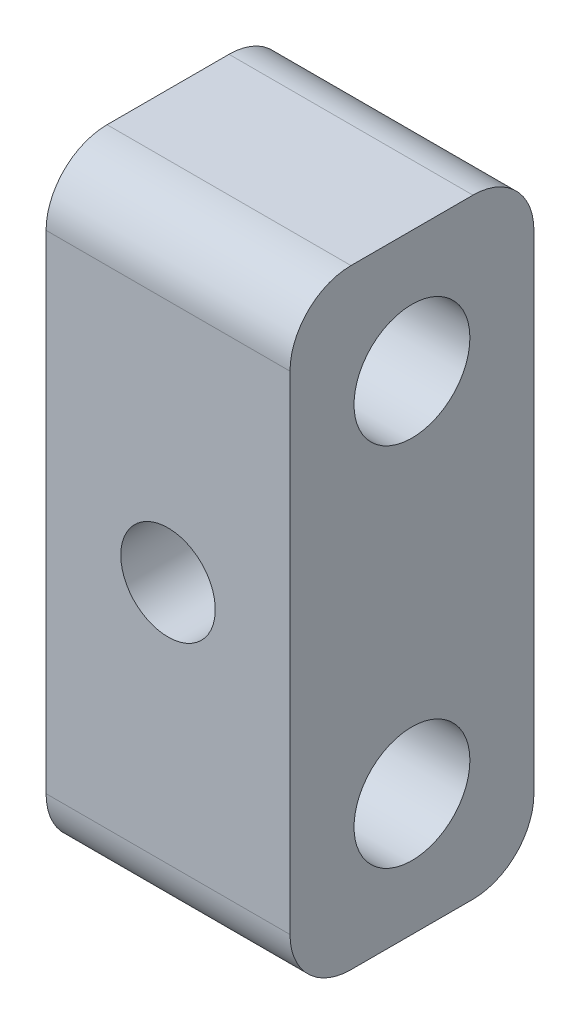
ISO-10303-21;
HEADER;
FILE_DESCRIPTION(('STEP AP214'),'2;1');
FILE_NAME('part.step','',(''),(''),'','','');
FILE_SCHEMA(('AUTOMOTIVE_DESIGN { 1 0 10303 214 1 1 1 1 }'));
ENDSEC;
DATA;
#1=APPLICATION_CONTEXT('core data for automotive mechanical design processes');
#2=APPLICATION_PROTOCOL_DEFINITION('international standard','automotive_design',2000,#1);
#3=PRODUCT_CONTEXT('',#1,'mechanical');
#4=PRODUCT('Part','Part','',(#3));
#5=PRODUCT_RELATED_PRODUCT_CATEGORY('part','',(#4));
#6=PRODUCT_DEFINITION_FORMATION('','',#4);
#7=PRODUCT_DEFINITION_CONTEXT('part definition',#1,'design');
#8=PRODUCT_DEFINITION('design','',#6,#7);
#9=PRODUCT_DEFINITION_SHAPE('','',#8);
#10=(LENGTH_UNIT() NAMED_UNIT(*) SI_UNIT(.MILLI.,.METRE.));
#11=(NAMED_UNIT(*) PLANE_ANGLE_UNIT() SI_UNIT($,.RADIAN.));
#12=(NAMED_UNIT(*) SI_UNIT($,.STERADIAN.) SOLID_ANGLE_UNIT());
#13=UNCERTAINTY_MEASURE_WITH_UNIT(LENGTH_MEASURE(1.E-05),#10,'distance_accuracy_value','');
#14=(GEOMETRIC_REPRESENTATION_CONTEXT(3) GLOBAL_UNCERTAINTY_ASSIGNED_CONTEXT((#13)) GLOBAL_UNIT_ASSIGNED_CONTEXT((#10,
#11,#12)) REPRESENTATION_CONTEXT('',''));
#15=CARTESIAN_POINT('',(0.,0.,0.));
#16=DIRECTION('',(0.,0.,1.));
#17=DIRECTION('',(1.,0.,0.));
#18=AXIS2_PLACEMENT_3D('',#15,#16,#17);
#19=CARTESIAN_POINT('',(4.,0.,4.));
#20=DIRECTION('',(0.,0.,-1.));
#21=DIRECTION('',(-1.,0.,0.));
#22=AXIS2_PLACEMENT_3D('',#19,#20,#21);
#23=CYLINDRICAL_SURFACE('',#22,1.55);
#24=CARTESIAN_POINT('',(4.,0.,4.));
#25=DIRECTION('',(0.,0.,-1.));
#26=DIRECTION('',(-1.,0.,0.));
#27=AXIS2_PLACEMENT_3D('',#24,#25,#26);
#28=CIRCLE('',#27,1.55);
#29=CARTESIAN_POINT('',(2.45,0.,4.));
#30=VERTEX_POINT('',#29);
#31=EDGE_CURVE('E208',#30,#30,#28,.T.);
#32=ORIENTED_EDGE('',*,*,#31,.F.);
#33=EDGE_LOOP('',(#32));
#34=FACE_BOUND('',#33,.T.);
#35=CARTESIAN_POINT('',(4.,0.,1.));
#36=DIRECTION('',(0.,0.,-1.));
#37=DIRECTION('',(-1.,0.,0.));
#38=AXIS2_PLACEMENT_3D('',#35,#36,#37);
#39=CIRCLE('',#38,1.55);
#40=CARTESIAN_POINT('',(2.45,0.,1.));
#41=VERTEX_POINT('',#40);
#42=EDGE_CURVE('E187',#41,#41,#39,.F.);
#43=ORIENTED_EDGE('',*,*,#42,.F.);
#44=EDGE_LOOP('',(#43));
#45=FACE_BOUND('',#44,.T.);
#46=ADVANCED_FACE('F33',(#34,#45),#23,.F.);
#47=CARTESIAN_POINT('',(8.,6.,0.));
#48=DIRECTION('',(-1.,0.,0.));
#49=DIRECTION('',(0.,0.,1.));
#50=AXIS2_PLACEMENT_3D('',#47,#48,#49);
#51=CYLINDRICAL_SURFACE('',#50,1.55);
#52=CARTESIAN_POINT('',(0.,6.,0.));
#53=DIRECTION('',(1.,0.,0.));
#54=DIRECTION('',(0.,0.,-1.));
#55=AXIS2_PLACEMENT_3D('',#52,#53,#54);
#56=CIRCLE('',#55,1.55);
#57=CARTESIAN_POINT('',(0.,6.,-1.55));
#58=VERTEX_POINT('',#57);
#59=EDGE_CURVE('E215',#58,#58,#56,.T.);
#60=ORIENTED_EDGE('',*,*,#59,.F.);
#61=EDGE_LOOP('',(#60));
#62=FACE_BOUND('',#61,.T.);
#63=CARTESIAN_POINT('',(5.,6.,0.));
#64=DIRECTION('',(1.,0.,0.));
#65=DIRECTION('',(0.,0.,-1.));
#66=AXIS2_PLACEMENT_3D('',#63,#64,#65);
#67=CIRCLE('',#66,1.55);
#68=CARTESIAN_POINT('',(5.,6.,-1.55));
#69=VERTEX_POINT('',#68);
#70=EDGE_CURVE('E212',#69,#69,#67,.T.);
#71=ORIENTED_EDGE('',*,*,#70,.T.);
#72=EDGE_LOOP('',(#71));
#73=FACE_BOUND('',#72,.T.);
#74=ADVANCED_FACE('F314',(#62,#73),#51,.F.);
#75=CARTESIAN_POINT('',(8.,-6.,0.));
#76=DIRECTION('',(-1.,0.,0.));
#77=DIRECTION('',(0.,0.,1.));
#78=AXIS2_PLACEMENT_3D('',#75,#76,#77);
#79=CYLINDRICAL_SURFACE('',#78,1.55);
#80=CARTESIAN_POINT('',(0.,-6.,0.));
#81=DIRECTION('',(1.,0.,0.));
#82=DIRECTION('',(0.,0.,1.));
#83=AXIS2_PLACEMENT_3D('',#80,#81,#82);
#84=CIRCLE('',#83,1.55);
#85=CARTESIAN_POINT('',(0.,-6.,1.55));
#86=VERTEX_POINT('',#85);
#87=EDGE_CURVE('E211',#86,#86,#84,.T.);
#88=ORIENTED_EDGE('',*,*,#87,.F.);
#89=EDGE_LOOP('',(#88));
#90=FACE_BOUND('',#89,.T.);
#91=CARTESIAN_POINT('',(5.,-6.,0.));
#92=DIRECTION('',(1.,0.,0.));
#93=DIRECTION('',(0.,0.,-1.));
#94=AXIS2_PLACEMENT_3D('',#91,#92,#93);
#95=CIRCLE('',#94,1.55);
#96=CARTESIAN_POINT('',(5.,-6.,-1.55));
#97=VERTEX_POINT('',#96);
#98=EDGE_CURVE('E198',#97,#97,#95,.T.);
#99=ORIENTED_EDGE('',*,*,#98,.T.);
#100=EDGE_LOOP('',(#99));
#101=FACE_BOUND('',#100,.T.);
#102=ADVANCED_FACE('F320',(#90,#101),#79,.F.);
#103=CARTESIAN_POINT('',(8.,0.,0.));
#104=DIRECTION('',(-1.,0.,0.));
#105=DIRECTION('',(0.,0.,1.));
#106=AXIS2_PLACEMENT_3D('',#103,#104,#105);
#107=PLANE('',#106);
#108=CARTESIAN_POINT('',(8.,6.,0.));
#109=DIRECTION('',(1.,0.,0.));
#110=DIRECTION('',(0.,0.,-1.));
#111=AXIS2_PLACEMENT_3D('',#108,#109,#110);
#112=CIRCLE('',#111,1.9);
#113=CARTESIAN_POINT('',(8.,6.,-1.9));
#114=VERTEX_POINT('',#113);
#115=EDGE_CURVE('E199',#114,#114,#112,.T.);
#116=ORIENTED_EDGE('',*,*,#115,.F.);
#117=EDGE_LOOP('',(#116));
#118=FACE_BOUND('',#117,.T.);
#119=CARTESIAN_POINT('',(8.,-6.,0.));
#120=DIRECTION('',(1.,0.,0.));
#121=DIRECTION('',(0.,0.,-1.));
#122=AXIS2_PLACEMENT_3D('',#119,#120,#121);
#123=CIRCLE('',#122,1.9);
#124=CARTESIAN_POINT('',(8.,-6.,-1.9));
#125=VERTEX_POINT('',#124);
#126=EDGE_CURVE('E205',#125,#125,#123,.T.);
#127=ORIENTED_EDGE('',*,*,#126,.F.);
#128=EDGE_LOOP('',(#127));
#129=FACE_BOUND('',#128,.T.);
#130=DIRECTION('',(0.,-1.,0.));
#131=VECTOR('',#130,1.);
#132=CARTESIAN_POINT('',(8.,-10.,4.));
#133=LINE('',#132,#131);
#134=CARTESIAN_POINT('',(8.,8.,4.));
#135=VERTEX_POINT('',#134);
#136=CARTESIAN_POINT('',(8.,-8.,4.));
#137=VERTEX_POINT('',#136);
#138=EDGE_CURVE('E224',#135,#137,#133,.T.);
#139=ORIENTED_EDGE('',*,*,#138,.T.);
#140=CARTESIAN_POINT('',(8.,-8.,2.));
#141=DIRECTION('',(-1.,0.,0.));
#142=DIRECTION('',(0.,0.,1.));
#143=AXIS2_PLACEMENT_3D('',#140,#141,#142);
#144=CIRCLE('',#143,2.);
#145=CARTESIAN_POINT('',(8.,-10.,2.));
#146=VERTEX_POINT('',#145);
#147=EDGE_CURVE('E268',#137,#146,#144,.F.);
#148=ORIENTED_EDGE('',*,*,#147,.T.);
#149=DIRECTION('',(0.,0.,-1.));
#150=VECTOR('',#149,1.);
#151=CARTESIAN_POINT('',(8.,-10.,4.));
#152=LINE('',#151,#150);
#153=CARTESIAN_POINT('',(8.,-10.,-2.));
#154=VERTEX_POINT('',#153);
#155=EDGE_CURVE('E227',#146,#154,#152,.T.);
#156=ORIENTED_EDGE('',*,*,#155,.T.);
#157=CARTESIAN_POINT('',(8.,-8.,-2.));
#158=DIRECTION('',(-1.,0.,0.));
#159=DIRECTION('',(0.,0.,1.));
#160=AXIS2_PLACEMENT_3D('',#157,#158,#159);
#161=CIRCLE('',#160,2.);
#162=CARTESIAN_POINT('',(8.,-8.,-4.));
#163=VERTEX_POINT('',#162);
#164=EDGE_CURVE('E263',#154,#163,#161,.F.);
#165=ORIENTED_EDGE('',*,*,#164,.T.);
#166=DIRECTION('',(0.,1.,0.));
#167=VECTOR('',#166,1.);
#168=CARTESIAN_POINT('',(8.,-10.,-4.));
#169=LINE('',#168,#167);
#170=CARTESIAN_POINT('',(8.,8.,-4.));
#171=VERTEX_POINT('',#170);
#172=EDGE_CURVE('E219',#163,#171,#169,.T.);
#173=ORIENTED_EDGE('',*,*,#172,.T.);
#174=CARTESIAN_POINT('',(8.,8.,-2.));
#175=DIRECTION('',(-1.,0.,0.));
#176=DIRECTION('',(0.,0.,1.));
#177=AXIS2_PLACEMENT_3D('',#174,#175,#176);
#178=CIRCLE('',#177,2.);
#179=CARTESIAN_POINT('',(8.,10.,-2.));
#180=VERTEX_POINT('',#179);
#181=EDGE_CURVE('E55',#171,#180,#178,.F.);
#182=ORIENTED_EDGE('',*,*,#181,.T.);
#183=DIRECTION('',(0.,0.,1.));
#184=VECTOR('',#183,1.);
#185=CARTESIAN_POINT('',(8.,10.,4.));
#186=LINE('',#185,#184);
#187=CARTESIAN_POINT('',(8.,10.,2.));
#188=VERTEX_POINT('',#187);
#189=EDGE_CURVE('E221',#180,#188,#186,.T.);
#190=ORIENTED_EDGE('',*,*,#189,.T.);
#191=CARTESIAN_POINT('',(8.,8.,2.));
#192=DIRECTION('',(-1.,0.,0.));
#193=DIRECTION('',(0.,0.,1.));
#194=AXIS2_PLACEMENT_3D('',#191,#192,#193);
#195=CIRCLE('',#194,2.);
#196=EDGE_CURVE('E266',#188,#135,#195,.F.);
#197=ORIENTED_EDGE('',*,*,#196,.T.);
#198=EDGE_LOOP('',(#139,#148,#156,#165,#173,#182,#190,#197));
#199=FACE_BOUND('',#198,.T.);
#200=ADVANCED_FACE('F292',(#118,#129,#199),#107,.F.);
#201=CARTESIAN_POINT('',(0.,0.,0.));
#202=DIRECTION('',(-1.,0.,0.));
#203=DIRECTION('',(0.,0.,1.));
#204=AXIS2_PLACEMENT_3D('',#201,#202,#203);
#205=PLANE('',#204);
#206=ORIENTED_EDGE('',*,*,#59,.T.);
#207=EDGE_LOOP('',(#206));
#208=FACE_BOUND('',#207,.T.);
#209=DIRECTION('',(0.,0.,-1.));
#210=VECTOR('',#209,1.);
#211=CARTESIAN_POINT('',(0.,-10.,4.));
#212=LINE('',#211,#210);
#213=CARTESIAN_POINT('',(0.,-10.,2.));
#214=VERTEX_POINT('',#213);
#215=CARTESIAN_POINT('',(0.,-10.,-2.));
#216=VERTEX_POINT('',#215);
#217=EDGE_CURVE('E222',#214,#216,#212,.T.);
#218=ORIENTED_EDGE('',*,*,#217,.F.);
#219=CARTESIAN_POINT('',(0.,-8.,2.));
#220=DIRECTION('',(-1.,0.,0.));
#221=DIRECTION('',(0.,0.,1.));
#222=AXIS2_PLACEMENT_3D('',#219,#220,#221);
#223=CIRCLE('',#222,2.);
#224=CARTESIAN_POINT('',(0.,-8.,4.));
#225=VERTEX_POINT('',#224);
#226=EDGE_CURVE('E256',#214,#225,#223,.T.);
#227=ORIENTED_EDGE('',*,*,#226,.T.);
#228=DIRECTION('',(0.,-1.,0.));
#229=VECTOR('',#228,1.);
#230=CARTESIAN_POINT('',(0.,-10.,4.));
#231=LINE('',#230,#229);
#232=CARTESIAN_POINT('',(0.,8.,4.));
#233=VERTEX_POINT('',#232);
#234=EDGE_CURVE('E235',#233,#225,#231,.T.);
#235=ORIENTED_EDGE('',*,*,#234,.F.);
#236=CARTESIAN_POINT('',(0.,8.,2.));
#237=DIRECTION('',(-1.,0.,0.));
#238=DIRECTION('',(0.,0.,1.));
#239=AXIS2_PLACEMENT_3D('',#236,#237,#238);
#240=CIRCLE('',#239,2.);
#241=CARTESIAN_POINT('',(0.,10.,2.));
#242=VERTEX_POINT('',#241);
#243=EDGE_CURVE('E254',#233,#242,#240,.T.);
#244=ORIENTED_EDGE('',*,*,#243,.T.);
#245=DIRECTION('',(0.,0.,1.));
#246=VECTOR('',#245,1.);
#247=CARTESIAN_POINT('',(0.,10.,4.));
#248=LINE('',#247,#246);
#249=CARTESIAN_POINT('',(0.,10.,-2.));
#250=VERTEX_POINT('',#249);
#251=EDGE_CURVE('E233',#250,#242,#248,.T.);
#252=ORIENTED_EDGE('',*,*,#251,.F.);
#253=CARTESIAN_POINT('',(0.,8.,-2.));
#254=DIRECTION('',(-1.,0.,0.));
#255=DIRECTION('',(0.,0.,1.));
#256=AXIS2_PLACEMENT_3D('',#253,#254,#255);
#257=CIRCLE('',#256,2.);
#258=CARTESIAN_POINT('',(0.,8.,-4.));
#259=VERTEX_POINT('',#258);
#260=EDGE_CURVE('E252',#250,#259,#257,.T.);
#261=ORIENTED_EDGE('',*,*,#260,.T.);
#262=DIRECTION('',(0.,1.,0.));
#263=VECTOR('',#262,1.);
#264=CARTESIAN_POINT('',(0.,-10.,-4.));
#265=LINE('',#264,#263);
#266=CARTESIAN_POINT('',(0.,-8.,-4.));
#267=VERTEX_POINT('',#266);
#268=EDGE_CURVE('E218',#267,#259,#265,.T.);
#269=ORIENTED_EDGE('',*,*,#268,.F.);
#270=CARTESIAN_POINT('',(0.,-8.,-2.));
#271=DIRECTION('',(-1.,0.,0.));
#272=DIRECTION('',(0.,0.,1.));
#273=AXIS2_PLACEMENT_3D('',#270,#271,#272);
#274=CIRCLE('',#273,2.);
#275=EDGE_CURVE('E250',#267,#216,#274,.T.);
#276=ORIENTED_EDGE('',*,*,#275,.T.);
#277=EDGE_LOOP('',(#218,#227,#235,#244,#252,#261,#269,#276));
#278=FACE_BOUND('',#277,.T.);
#279=ORIENTED_EDGE('',*,*,#87,.T.);
#280=EDGE_LOOP('',(#279));
#281=FACE_BOUND('',#280,.T.);
#282=ADVANCED_FACE('F284',(#208,#278,#281),#205,.T.);
#283=CARTESIAN_POINT('',(8.,-10.,-4.));
#284=DIRECTION('',(0.,0.,1.));
#285=DIRECTION('',(1.,0.,0.));
#286=AXIS2_PLACEMENT_3D('',#283,#284,#285);
#287=PLANE('',#286);
#288=DIRECTION('',(0.5,-0.866025403784439,0.));
#289=VECTOR('',#288,1.);
#290=CARTESIAN_POINT('',(5.58771324027147,2.75,-4.));
#291=LINE('',#290,#289);
#292=CARTESIAN_POINT('',(5.58771324027147,2.75,-4.));
#293=VERTEX_POINT('',#292);
#294=CARTESIAN_POINT('',(7.17542648054294,0.,-4.));
#295=VERTEX_POINT('',#294);
#296=EDGE_CURVE('E175',#293,#295,#291,.T.);
#297=ORIENTED_EDGE('',*,*,#296,.F.);
#298=DIRECTION('',(1.,0.,0.));
#299=VECTOR('',#298,1.);
#300=CARTESIAN_POINT('',(2.41228675972853,2.75,-4.));
#301=LINE('',#300,#299);
#302=CARTESIAN_POINT('',(2.41228675972853,2.75,-4.));
#303=VERTEX_POINT('',#302);
#304=EDGE_CURVE('E142',#303,#293,#301,.T.);
#305=ORIENTED_EDGE('',*,*,#304,.F.);
#306=DIRECTION('',(0.5,0.866025403784439,0.));
#307=VECTOR('',#306,1.);
#308=CARTESIAN_POINT('',(0.824573519457056,0.,-4.));
#309=LINE('',#308,#307);
#310=CARTESIAN_POINT('',(0.824573519457056,0.,-4.));
#311=VERTEX_POINT('',#310);
#312=EDGE_CURVE('E161',#311,#303,#309,.T.);
#313=ORIENTED_EDGE('',*,*,#312,.F.);
#314=DIRECTION('',(-0.5,0.866025403784438,0.));
#315=VECTOR('',#314,1.);
#316=CARTESIAN_POINT('',(2.41228675972853,-2.75,-4.));
#317=LINE('',#316,#315);
#318=CARTESIAN_POINT('',(2.41228675972853,-2.75,-4.));
#319=VERTEX_POINT('',#318);
#320=EDGE_CURVE('E164',#319,#311,#317,.T.);
#321=ORIENTED_EDGE('',*,*,#320,.F.);
#322=DIRECTION('',(-1.,0.,0.));
#323=VECTOR('',#322,1.);
#324=CARTESIAN_POINT('',(5.58771324027147,-2.75,-4.));
#325=LINE('',#324,#323);
#326=CARTESIAN_POINT('',(5.58771324027147,-2.75,-4.));
#327=VERTEX_POINT('',#326);
#328=EDGE_CURVE('E180',#327,#319,#325,.T.);
#329=ORIENTED_EDGE('',*,*,#328,.F.);
#330=DIRECTION('',(-0.5,-0.866025403784439,0.));
#331=VECTOR('',#330,1.);
#332=CARTESIAN_POINT('',(7.17542648054294,0.,-4.));
#333=LINE('',#332,#331);
#334=EDGE_CURVE('E177',#295,#327,#333,.T.);
#335=ORIENTED_EDGE('',*,*,#334,.F.);
#336=EDGE_LOOP('',(#297,#305,#313,#321,#329,#335));
#337=FACE_BOUND('',#336,.T.);
#338=ORIENTED_EDGE('',*,*,#268,.T.);
#339=DIRECTION('',(-1.,0.,0.));
#340=VECTOR('',#339,1.);
#341=CARTESIAN_POINT('',(8.,8.,-4.));
#342=LINE('',#341,#340);
#343=EDGE_CURVE('E11',#259,#171,#342,.F.);
#344=ORIENTED_EDGE('',*,*,#343,.T.);
#345=ORIENTED_EDGE('',*,*,#172,.F.);
#346=DIRECTION('',(-1.,0.,0.));
#347=VECTOR('',#346,1.);
#348=CARTESIAN_POINT('',(8.,-8.,-4.));
#349=LINE('',#348,#347);
#350=EDGE_CURVE('E41',#163,#267,#349,.T.);
#351=ORIENTED_EDGE('',*,*,#350,.T.);
#352=EDGE_LOOP('',(#338,#344,#345,#351));
#353=FACE_BOUND('',#352,.T.);
#354=ADVANCED_FACE('F278',(#337,#353),#287,.F.);
#355=CARTESIAN_POINT('',(8.,10.,4.));
#356=DIRECTION('',(0.,-1.,0.));
#357=DIRECTION('',(0.,0.,-1.));
#358=AXIS2_PLACEMENT_3D('',#355,#356,#357);
#359=PLANE('',#358);
#360=ORIENTED_EDGE('',*,*,#251,.T.);
#361=DIRECTION('',(-1.,0.,0.));
#362=VECTOR('',#361,1.);
#363=CARTESIAN_POINT('',(8.,10.,2.));
#364=LINE('',#363,#362);
#365=EDGE_CURVE('E48',#242,#188,#364,.F.);
#366=ORIENTED_EDGE('',*,*,#365,.T.);
#367=ORIENTED_EDGE('',*,*,#189,.F.);
#368=DIRECTION('',(-1.,0.,0.));
#369=VECTOR('',#368,1.);
#370=CARTESIAN_POINT('',(8.,10.,-2.));
#371=LINE('',#370,#369);
#372=EDGE_CURVE('E270',#180,#250,#371,.T.);
#373=ORIENTED_EDGE('',*,*,#372,.T.);
#374=EDGE_LOOP('',(#360,#366,#367,#373));
#375=FACE_BOUND('',#374,.T.);
#376=ADVANCED_FACE('F290',(#375),#359,.F.);
#377=CARTESIAN_POINT('',(8.,-10.,4.));
#378=DIRECTION('',(0.,0.,-1.));
#379=DIRECTION('',(-1.,0.,0.));
#380=AXIS2_PLACEMENT_3D('',#377,#378,#379);
#381=PLANE('',#380);
#382=ORIENTED_EDGE('',*,*,#31,.T.);
#383=EDGE_LOOP('',(#382));
#384=FACE_BOUND('',#383,.T.);
#385=ORIENTED_EDGE('',*,*,#234,.T.);
#386=DIRECTION('',(-1.,0.,0.));
#387=VECTOR('',#386,1.);
#388=CARTESIAN_POINT('',(8.,-8.,4.));
#389=LINE('',#388,#387);
#390=EDGE_CURVE('E261',#225,#137,#389,.F.);
#391=ORIENTED_EDGE('',*,*,#390,.T.);
#392=ORIENTED_EDGE('',*,*,#138,.F.);
#393=DIRECTION('',(-1.,0.,0.));
#394=VECTOR('',#393,1.);
#395=CARTESIAN_POINT('',(8.,8.,4.));
#396=LINE('',#395,#394);
#397=EDGE_CURVE('E258',#135,#233,#396,.T.);
#398=ORIENTED_EDGE('',*,*,#397,.T.);
#399=EDGE_LOOP('',(#385,#391,#392,#398));
#400=FACE_BOUND('',#399,.T.);
#401=ADVANCED_FACE('F299',(#384,#400),#381,.F.);
#402=CARTESIAN_POINT('',(8.,-10.,4.));
#403=DIRECTION('',(0.,1.,0.));
#404=DIRECTION('',(0.,0.,1.));
#405=AXIS2_PLACEMENT_3D('',#402,#403,#404);
#406=PLANE('',#405);
#407=ORIENTED_EDGE('',*,*,#155,.F.);
#408=DIRECTION('',(-1.,0.,0.));
#409=VECTOR('',#408,1.);
#410=CARTESIAN_POINT('',(8.,-10.,2.));
#411=LINE('',#410,#409);
#412=EDGE_CURVE('E247',#146,#214,#411,.T.);
#413=ORIENTED_EDGE('',*,*,#412,.T.);
#414=ORIENTED_EDGE('',*,*,#217,.T.);
#415=DIRECTION('',(-1.,0.,0.));
#416=VECTOR('',#415,1.);
#417=CARTESIAN_POINT('',(8.,-10.,-2.));
#418=LINE('',#417,#416);
#419=EDGE_CURVE('E230',#216,#154,#418,.F.);
#420=ORIENTED_EDGE('',*,*,#419,.T.);
#421=EDGE_LOOP('',(#407,#413,#414,#420));
#422=FACE_BOUND('',#421,.T.);
#423=ADVANCED_FACE('F307',(#422),#406,.F.);
#424=CARTESIAN_POINT('',(5.,-6.,0.));
#425=DIRECTION('',(1.,0.,0.));
#426=DIRECTION('',(0.,0.,-1.));
#427=AXIS2_PLACEMENT_3D('',#424,#425,#426);
#428=CYLINDRICAL_SURFACE('',#427,1.9);
#429=CARTESIAN_POINT('',(5.,-6.,0.));
#430=DIRECTION('',(1.,0.,0.));
#431=DIRECTION('',(0.,0.,-1.));
#432=AXIS2_PLACEMENT_3D('',#429,#430,#431);
#433=CIRCLE('',#432,1.9);
#434=CARTESIAN_POINT('',(5.,-6.,-1.9));
#435=VERTEX_POINT('',#434);
#436=EDGE_CURVE('E202',#435,#435,#433,.T.);
#437=ORIENTED_EDGE('',*,*,#436,.F.);
#438=EDGE_LOOP('',(#437));
#439=FACE_BOUND('',#438,.T.);
#440=ORIENTED_EDGE('',*,*,#126,.T.);
#441=EDGE_LOOP('',(#440));
#442=FACE_BOUND('',#441,.T.);
#443=ADVANCED_FACE('F327',(#439,#442),#428,.F.);
#444=CARTESIAN_POINT('',(5.,-6.,0.));
#445=DIRECTION('',(1.,0.,0.));
#446=DIRECTION('',(0.,0.,-1.));
#447=AXIS2_PLACEMENT_3D('',#444,#445,#446);
#448=PLANE('',#447);
#449=ORIENTED_EDGE('',*,*,#98,.F.);
#450=EDGE_LOOP('',(#449));
#451=FACE_BOUND('',#450,.T.);
#452=ORIENTED_EDGE('',*,*,#436,.T.);
#453=EDGE_LOOP('',(#452));
#454=FACE_BOUND('',#453,.T.);
#455=ADVANCED_FACE('F452',(#451,#454),#448,.T.);
#456=CARTESIAN_POINT('',(5.,6.,0.));
#457=DIRECTION('',(1.,0.,0.));
#458=DIRECTION('',(0.,0.,-1.));
#459=AXIS2_PLACEMENT_3D('',#456,#457,#458);
#460=CYLINDRICAL_SURFACE('',#459,1.9);
#461=CARTESIAN_POINT('',(5.,6.,0.));
#462=DIRECTION('',(1.,0.,0.));
#463=DIRECTION('',(0.,0.,-1.));
#464=AXIS2_PLACEMENT_3D('',#461,#462,#463);
#465=CIRCLE('',#464,1.9);
#466=CARTESIAN_POINT('',(5.,6.,-1.9));
#467=VERTEX_POINT('',#466);
#468=EDGE_CURVE('E195',#467,#467,#465,.T.);
#469=ORIENTED_EDGE('',*,*,#468,.F.);
#470=EDGE_LOOP('',(#469));
#471=FACE_BOUND('',#470,.T.);
#472=ORIENTED_EDGE('',*,*,#115,.T.);
#473=EDGE_LOOP('',(#472));
#474=FACE_BOUND('',#473,.T.);
#475=ADVANCED_FACE('F443',(#471,#474),#460,.F.);
#476=CARTESIAN_POINT('',(5.,6.,0.));
#477=DIRECTION('',(1.,0.,0.));
#478=DIRECTION('',(0.,0.,-1.));
#479=AXIS2_PLACEMENT_3D('',#476,#477,#478);
#480=PLANE('',#479);
#481=ORIENTED_EDGE('',*,*,#70,.F.);
#482=EDGE_LOOP('',(#481));
#483=FACE_BOUND('',#482,.T.);
#484=ORIENTED_EDGE('',*,*,#468,.T.);
#485=EDGE_LOOP('',(#484));
#486=FACE_BOUND('',#485,.T.);
#487=ADVANCED_FACE('F431',(#483,#486),#480,.T.);
#488=CARTESIAN_POINT('',(0.,0.,1.));
#489=DIRECTION('',(0.,0.,-1.));
#490=DIRECTION('',(-1.,0.,0.));
#491=AXIS2_PLACEMENT_3D('',#488,#489,#490);
#492=PLANE('',#491);
#493=DIRECTION('',(1.,0.,0.));
#494=VECTOR('',#493,1.);
#495=CARTESIAN_POINT('',(2.41228675972853,2.75,1.));
#496=LINE('',#495,#494);
#497=CARTESIAN_POINT('',(2.41228675972853,2.75,1.));
#498=VERTEX_POINT('',#497);
#499=CARTESIAN_POINT('',(5.58771324027147,2.75,1.));
#500=VERTEX_POINT('',#499);
#501=EDGE_CURVE('E139',#498,#500,#496,.T.);
#502=ORIENTED_EDGE('',*,*,#501,.T.);
#503=DIRECTION('',(0.5,-0.866025403784439,0.));
#504=VECTOR('',#503,1.);
#505=CARTESIAN_POINT('',(5.58771324027147,2.75,1.));
#506=LINE('',#505,#504);
#507=CARTESIAN_POINT('',(7.17542648054294,0.,1.));
#508=VERTEX_POINT('',#507);
#509=EDGE_CURVE('E150',#500,#508,#506,.T.);
#510=ORIENTED_EDGE('',*,*,#509,.T.);
#511=DIRECTION('',(-0.5,-0.866025403784439,0.));
#512=VECTOR('',#511,1.);
#513=CARTESIAN_POINT('',(7.17542648054294,0.,1.));
#514=LINE('',#513,#512);
#515=CARTESIAN_POINT('',(5.58771324027147,-2.75,1.));
#516=VERTEX_POINT('',#515);
#517=EDGE_CURVE('E155',#508,#516,#514,.T.);
#518=ORIENTED_EDGE('',*,*,#517,.T.);
#519=DIRECTION('',(-1.,0.,0.));
#520=VECTOR('',#519,1.);
#521=CARTESIAN_POINT('',(5.58771324027147,-2.75,1.));
#522=LINE('',#521,#520);
#523=CARTESIAN_POINT('',(2.41228675972853,-2.75,1.));
#524=VERTEX_POINT('',#523);
#525=EDGE_CURVE('E168',#516,#524,#522,.T.);
#526=ORIENTED_EDGE('',*,*,#525,.T.);
#527=DIRECTION('',(-0.5,0.866025403784438,0.));
#528=VECTOR('',#527,1.);
#529=CARTESIAN_POINT('',(2.41228675972853,-2.75,1.));
#530=LINE('',#529,#528);
#531=CARTESIAN_POINT('',(0.824573519457056,0.,1.));
#532=VERTEX_POINT('',#531);
#533=EDGE_CURVE('E171',#524,#532,#530,.T.);
#534=ORIENTED_EDGE('',*,*,#533,.T.);
#535=DIRECTION('',(0.5,0.866025403784439,0.));
#536=VECTOR('',#535,1.);
#537=CARTESIAN_POINT('',(0.824573519457056,0.,1.));
#538=LINE('',#537,#536);
#539=EDGE_CURVE('E147',#532,#498,#538,.T.);
#540=ORIENTED_EDGE('',*,*,#539,.T.);
#541=EDGE_LOOP('',(#502,#510,#518,#526,#534,#540));
#542=FACE_BOUND('',#541,.T.);
#543=ORIENTED_EDGE('',*,*,#42,.T.);
#544=EDGE_LOOP('',(#543));
#545=FACE_BOUND('',#544,.T.);
#546=ADVANCED_FACE('F157',(#542,#545),#492,.T.);
#547=CARTESIAN_POINT('',(2.41228675972853,2.75,1.));
#548=DIRECTION('',(0.,1.,0.));
#549=DIRECTION('',(0.,0.,1.));
#550=AXIS2_PLACEMENT_3D('',#547,#548,#549);
#551=PLANE('',#550);
#552=ORIENTED_EDGE('',*,*,#304,.T.);
#553=DIRECTION('',(0.,0.,-1.));
#554=VECTOR('',#553,1.);
#555=CARTESIAN_POINT('',(5.58771324027147,2.75,1.));
#556=LINE('',#555,#554);
#557=EDGE_CURVE('E135',#500,#293,#556,.T.);
#558=ORIENTED_EDGE('',*,*,#557,.F.);
#559=ORIENTED_EDGE('',*,*,#501,.F.);
#560=DIRECTION('',(0.,0.,-1.));
#561=VECTOR('',#560,1.);
#562=CARTESIAN_POINT('',(2.41228675972853,2.75,1.));
#563=LINE('',#562,#561);
#564=EDGE_CURVE('E185',#498,#303,#563,.T.);
#565=ORIENTED_EDGE('',*,*,#564,.T.);
#566=EDGE_LOOP('',(#552,#558,#559,#565));
#567=FACE_BOUND('',#566,.T.);
#568=ADVANCED_FACE('F137',(#567),#551,.F.);
#569=CARTESIAN_POINT('',(0.824573519457056,0.,1.));
#570=DIRECTION('',(-0.866025403784439,0.5,0.));
#571=DIRECTION('',(-0.5,-0.866025403784439,0.));
#572=AXIS2_PLACEMENT_3D('',#569,#570,#571);
#573=PLANE('',#572);
#574=ORIENTED_EDGE('',*,*,#312,.T.);
#575=ORIENTED_EDGE('',*,*,#564,.F.);
#576=ORIENTED_EDGE('',*,*,#539,.F.);
#577=DIRECTION('',(0.,0.,-1.));
#578=VECTOR('',#577,1.);
#579=CARTESIAN_POINT('',(0.824573519457056,0.,1.));
#580=LINE('',#579,#578);
#581=EDGE_CURVE('E188',#532,#311,#580,.T.);
#582=ORIENTED_EDGE('',*,*,#581,.T.);
#583=EDGE_LOOP('',(#574,#575,#576,#582));
#584=FACE_BOUND('',#583,.T.);
#585=ADVANCED_FACE('F407',(#584),#573,.F.);
#586=CARTESIAN_POINT('',(2.41228675972853,-2.75,1.));
#587=DIRECTION('',(-0.866025403784438,-0.5,0.));
#588=DIRECTION('',(0.5,-0.866025403784438,0.));
#589=AXIS2_PLACEMENT_3D('',#586,#587,#588);
#590=PLANE('',#589);
#591=ORIENTED_EDGE('',*,*,#320,.T.);
#592=ORIENTED_EDGE('',*,*,#581,.F.);
#593=ORIENTED_EDGE('',*,*,#533,.F.);
#594=DIRECTION('',(0.,0.,-1.));
#595=VECTOR('',#594,1.);
#596=CARTESIAN_POINT('',(2.41228675972853,-2.75,1.));
#597=LINE('',#596,#595);
#598=EDGE_CURVE('E190',#524,#319,#597,.T.);
#599=ORIENTED_EDGE('',*,*,#598,.T.);
#600=EDGE_LOOP('',(#591,#592,#593,#599));
#601=FACE_BOUND('',#600,.T.);
#602=ADVANCED_FACE('F398',(#601),#590,.F.);
#603=CARTESIAN_POINT('',(5.58771324027147,-2.75,1.));
#604=DIRECTION('',(0.,-1.,0.));
#605=DIRECTION('',(1.,0.,0.));
#606=AXIS2_PLACEMENT_3D('',#603,#604,#605);
#607=PLANE('',#606);
#608=ORIENTED_EDGE('',*,*,#328,.T.);
#609=ORIENTED_EDGE('',*,*,#598,.F.);
#610=ORIENTED_EDGE('',*,*,#525,.F.);
#611=DIRECTION('',(0.,0.,-1.));
#612=VECTOR('',#611,1.);
#613=CARTESIAN_POINT('',(5.58771324027147,-2.75,1.));
#614=LINE('',#613,#612);
#615=EDGE_CURVE('E192',#516,#327,#614,.T.);
#616=ORIENTED_EDGE('',*,*,#615,.T.);
#617=EDGE_LOOP('',(#608,#609,#610,#616));
#618=FACE_BOUND('',#617,.T.);
#619=ADVANCED_FACE('F389',(#618),#607,.F.);
#620=CARTESIAN_POINT('',(7.17542648054294,0.,1.));
#621=DIRECTION('',(0.866025403784439,-0.5,0.));
#622=DIRECTION('',(0.5,0.866025403784439,0.));
#623=AXIS2_PLACEMENT_3D('',#620,#621,#622);
#624=PLANE('',#623);
#625=ORIENTED_EDGE('',*,*,#334,.T.);
#626=ORIENTED_EDGE('',*,*,#615,.F.);
#627=ORIENTED_EDGE('',*,*,#517,.F.);
#628=DIRECTION('',(0.,0.,-1.));
#629=VECTOR('',#628,1.);
#630=CARTESIAN_POINT('',(7.17542648054294,0.,1.));
#631=LINE('',#630,#629);
#632=EDGE_CURVE('E146',#508,#295,#631,.T.);
#633=ORIENTED_EDGE('',*,*,#632,.T.);
#634=EDGE_LOOP('',(#625,#626,#627,#633));
#635=FACE_BOUND('',#634,.T.);
#636=ADVANCED_FACE('F380',(#635),#624,.F.);
#637=CARTESIAN_POINT('',(5.58771324027147,2.75,1.));
#638=DIRECTION('',(0.866025403784438,0.5,0.));
#639=DIRECTION('',(-0.5,0.866025403784439,0.));
#640=AXIS2_PLACEMENT_3D('',#637,#638,#639);
#641=PLANE('',#640);
#642=ORIENTED_EDGE('',*,*,#296,.T.);
#643=ORIENTED_EDGE('',*,*,#632,.F.);
#644=ORIENTED_EDGE('',*,*,#509,.F.);
#645=ORIENTED_EDGE('',*,*,#557,.T.);
#646=EDGE_LOOP('',(#642,#643,#644,#645));
#647=FACE_BOUND('',#646,.T.);
#648=ADVANCED_FACE('F151',(#647),#641,.F.);
#649=CARTESIAN_POINT('',(8.,-8.,2.));
#650=DIRECTION('',(-1.,0.,0.));
#651=DIRECTION('',(0.,0.,1.));
#652=AXIS2_PLACEMENT_3D('',#649,#650,#651);
#653=CYLINDRICAL_SURFACE('',#652,2.);
#654=ORIENTED_EDGE('',*,*,#147,.F.);
#655=ORIENTED_EDGE('',*,*,#390,.F.);
#656=ORIENTED_EDGE('',*,*,#226,.F.);
#657=ORIENTED_EDGE('',*,*,#412,.F.);
#658=EDGE_LOOP('',(#654,#655,#656,#657));
#659=FACE_BOUND('',#658,.T.);
#660=ADVANCED_FACE('F304',(#659),#653,.T.);
#661=CARTESIAN_POINT('',(8.,8.,2.));
#662=DIRECTION('',(-1.,0.,0.));
#663=DIRECTION('',(0.,0.,1.));
#664=AXIS2_PLACEMENT_3D('',#661,#662,#663);
#665=CYLINDRICAL_SURFACE('',#664,2.);
#666=ORIENTED_EDGE('',*,*,#196,.F.);
#667=ORIENTED_EDGE('',*,*,#365,.F.);
#668=ORIENTED_EDGE('',*,*,#243,.F.);
#669=ORIENTED_EDGE('',*,*,#397,.F.);
#670=EDGE_LOOP('',(#666,#667,#668,#669));
#671=FACE_BOUND('',#670,.T.);
#672=ADVANCED_FACE('F296',(#671),#665,.T.);
#673=CARTESIAN_POINT('',(8.,8.,-2.));
#674=DIRECTION('',(-1.,0.,0.));
#675=DIRECTION('',(0.,0.,1.));
#676=AXIS2_PLACEMENT_3D('',#673,#674,#675);
#677=CYLINDRICAL_SURFACE('',#676,2.);
#678=ORIENTED_EDGE('',*,*,#181,.F.);
#679=ORIENTED_EDGE('',*,*,#343,.F.);
#680=ORIENTED_EDGE('',*,*,#260,.F.);
#681=ORIENTED_EDGE('',*,*,#372,.F.);
#682=EDGE_LOOP('',(#678,#679,#680,#681));
#683=FACE_BOUND('',#682,.T.);
#684=ADVANCED_FACE('F289',(#683),#677,.T.);
#685=CARTESIAN_POINT('',(8.,-8.,-2.));
#686=DIRECTION('',(-1.,0.,0.));
#687=DIRECTION('',(0.,0.,1.));
#688=AXIS2_PLACEMENT_3D('',#685,#686,#687);
#689=CYLINDRICAL_SURFACE('',#688,2.);
#690=ORIENTED_EDGE('',*,*,#164,.F.);
#691=ORIENTED_EDGE('',*,*,#419,.F.);
#692=ORIENTED_EDGE('',*,*,#275,.F.);
#693=ORIENTED_EDGE('',*,*,#350,.F.);
#694=EDGE_LOOP('',(#690,#691,#692,#693));
#695=FACE_BOUND('',#694,.T.);
#696=ADVANCED_FACE('F35',(#695),#689,.T.);
#697=CLOSED_SHELL('',(#46,#74,#102,#200,#282,#354,#376,#401,#423,#443,#455,#475,#487,#546,#568,
#585,#602,#619,#636,#648,#660,#672,#684,#696));
#698=MANIFOLD_SOLID_BREP('B2',#697);
#699=ADVANCED_BREP_SHAPE_REPRESENTATION('',(#18,#698),#14);
#700=SHAPE_DEFINITION_REPRESENTATION(#9,#699);
ENDSEC;
END-ISO-10303-21;
